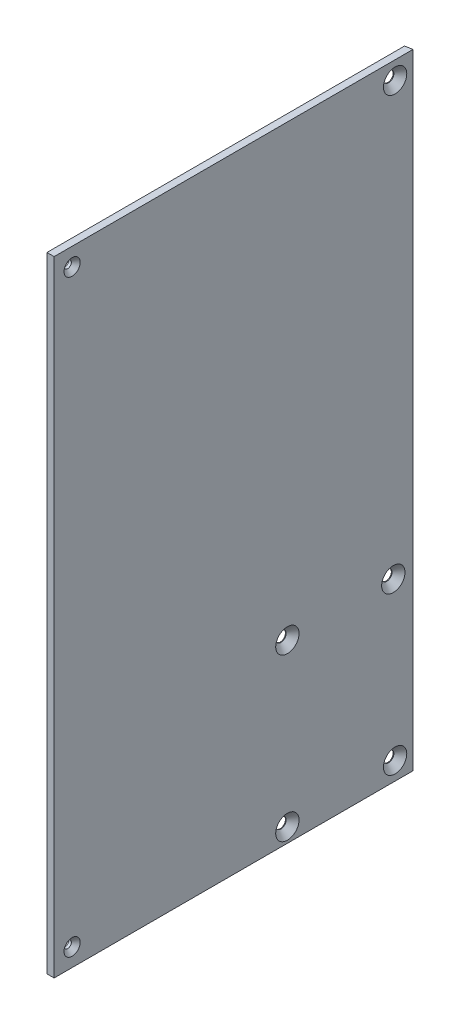
ISO-10303-21;
HEADER;
FILE_DESCRIPTION(('STEP AP214'),'2;1');
FILE_NAME('part.step','',(''),(''),'','','');
FILE_SCHEMA(('AUTOMOTIVE_DESIGN { 1 0 10303 214 1 1 1 1 }'));
ENDSEC;
DATA;
#1=APPLICATION_CONTEXT('core data for automotive mechanical design processes');
#2=APPLICATION_PROTOCOL_DEFINITION('international standard','automotive_design',2000,#1);
#3=PRODUCT_CONTEXT('',#1,'mechanical');
#4=PRODUCT('Part','Part','',(#3));
#5=PRODUCT_RELATED_PRODUCT_CATEGORY('part','',(#4));
#6=PRODUCT_DEFINITION_FORMATION('','',#4);
#7=PRODUCT_DEFINITION_CONTEXT('part definition',#1,'design');
#8=PRODUCT_DEFINITION('design','',#6,#7);
#9=PRODUCT_DEFINITION_SHAPE('','',#8);
#10=(LENGTH_UNIT() NAMED_UNIT(*) SI_UNIT(.MILLI.,.METRE.));
#11=(NAMED_UNIT(*) PLANE_ANGLE_UNIT() SI_UNIT($,.RADIAN.));
#12=(NAMED_UNIT(*) SI_UNIT($,.STERADIAN.) SOLID_ANGLE_UNIT());
#13=UNCERTAINTY_MEASURE_WITH_UNIT(LENGTH_MEASURE(1.E-05),#10,'distance_accuracy_value','');
#14=(GEOMETRIC_REPRESENTATION_CONTEXT(3) GLOBAL_UNCERTAINTY_ASSIGNED_CONTEXT((#13)) GLOBAL_UNIT_ASSIGNED_CONTEXT((#10,
#11,#12)) REPRESENTATION_CONTEXT('',''));
#15=CARTESIAN_POINT('',(0.,0.,0.));
#16=DIRECTION('',(0.,0.,1.));
#17=DIRECTION('',(1.,0.,0.));
#18=AXIS2_PLACEMENT_3D('',#15,#16,#17);
#19=CARTESIAN_POINT('',(80.9035305009001,3.,39.4332950003212));
#20=DIRECTION('',(0.,-1.,0.));
#21=DIRECTION('',(0.,0.,-1.));
#22=AXIS2_PLACEMENT_3D('',#19,#20,#21);
#23=PLANE('',#22);
#24=DIRECTION('',(-0.983268675216208,0.,0.18216122622162));
#25=VECTOR('',#24,1.);
#26=CARTESIAN_POINT('',(80.9035305009001,3.,39.8038167728806));
#27=LINE('',#26,#25);
#28=CARTESIAN_POINT('',(82.9035305009001,3.,39.4332950003212));
#29=VERTEX_POINT('',#28);
#30=CARTESIAN_POINT('',(80.9035305009001,3.,39.8038167728806));
#31=VERTEX_POINT('',#30);
#32=EDGE_CURVE('E99',#29,#31,#27,.T.);
#33=ORIENTED_EDGE('',*,*,#32,.F.);
#34=DIRECTION('',(0.,0.,-1.));
#35=VECTOR('',#34,1.);
#36=CARTESIAN_POINT('',(82.9035305009001,3.,39.4332950003212));
#37=LINE('',#36,#35);
#38=CARTESIAN_POINT('',(82.9035305009001,3.,139.399262949457));
#39=VERTEX_POINT('',#38);
#40=EDGE_CURVE('E94',#39,#29,#37,.T.);
#41=ORIENTED_EDGE('',*,*,#40,.F.);
#42=DIRECTION('',(1.,0.,0.));
#43=VECTOR('',#42,1.);
#44=CARTESIAN_POINT('',(80.9035305009001,3.,139.399262949457));
#45=LINE('',#44,#43);
#46=CARTESIAN_POINT('',(80.9035305009001,3.,139.399262949457));
#47=VERTEX_POINT('',#46);
#48=EDGE_CURVE('E11',#47,#39,#45,.T.);
#49=ORIENTED_EDGE('',*,*,#48,.F.);
#50=DIRECTION('',(0.,0.,-1.));
#51=VECTOR('',#50,1.);
#52=CARTESIAN_POINT('',(80.9035305009001,3.,39.4332950003212));
#53=LINE('',#52,#51);
#54=EDGE_CURVE('E106',#47,#31,#53,.T.);
#55=ORIENTED_EDGE('',*,*,#54,.T.);
#56=EDGE_LOOP('',(#33,#41,#49,#55));
#57=FACE_BOUND('',#56,.T.);
#58=ADVANCED_FACE('F49',(#57),#23,.T.);
#59=CARTESIAN_POINT('',(80.9035305009001,177.,139.399262949457));
#60=DIRECTION('',(0.,0.,1.));
#61=DIRECTION('',(1.,0.,0.));
#62=AXIS2_PLACEMENT_3D('',#59,#60,#61);
#63=PLANE('',#62);
#64=DIRECTION('',(0.,-1.,0.));
#65=VECTOR('',#64,1.);
#66=CARTESIAN_POINT('',(82.9035305009001,177.,139.399262949457));
#67=LINE('',#66,#65);
#68=CARTESIAN_POINT('',(82.9035305009001,177.,139.399262949457));
#69=VERTEX_POINT('',#68);
#70=EDGE_CURVE('E84',#69,#39,#67,.T.);
#71=ORIENTED_EDGE('',*,*,#70,.F.);
#72=DIRECTION('',(1.,0.,0.));
#73=VECTOR('',#72,1.);
#74=CARTESIAN_POINT('',(80.9035305009001,177.,139.399262949457));
#75=LINE('',#74,#73);
#76=CARTESIAN_POINT('',(80.9035305009001,177.,139.399262949457));
#77=VERTEX_POINT('',#76);
#78=EDGE_CURVE('E59',#77,#69,#75,.T.);
#79=ORIENTED_EDGE('',*,*,#78,.F.);
#80=DIRECTION('',(0.,-1.,0.));
#81=VECTOR('',#80,1.);
#82=CARTESIAN_POINT('',(80.9035305009001,177.,139.399262949457));
#83=LINE('',#82,#81);
#84=EDGE_CURVE('E87',#77,#47,#83,.T.);
#85=ORIENTED_EDGE('',*,*,#84,.T.);
#86=ORIENTED_EDGE('',*,*,#48,.T.);
#87=EDGE_LOOP('',(#71,#79,#85,#86));
#88=FACE_BOUND('',#87,.T.);
#89=ADVANCED_FACE('F83',(#88),#63,.T.);
#90=CARTESIAN_POINT('',(80.9035305009001,177.,39.4332950003212));
#91=DIRECTION('',(0.,1.,0.));
#92=DIRECTION('',(0.,0.,1.));
#93=AXIS2_PLACEMENT_3D('',#90,#91,#92);
#94=PLANE('',#93);
#95=DIRECTION('',(-0.983268675216208,0.,0.18216122622162));
#96=VECTOR('',#95,1.);
#97=CARTESIAN_POINT('',(80.9035305009001,177.,39.8038167728806));
#98=LINE('',#97,#96);
#99=CARTESIAN_POINT('',(82.9035305009001,177.,39.4332950003212));
#100=VERTEX_POINT('',#99);
#101=CARTESIAN_POINT('',(80.9035305009001,177.,39.8038167728806));
#102=VERTEX_POINT('',#101);
#103=EDGE_CURVE('E166',#100,#102,#98,.T.);
#104=ORIENTED_EDGE('',*,*,#103,.T.);
#105=DIRECTION('',(0.,0.,1.));
#106=VECTOR('',#105,1.);
#107=CARTESIAN_POINT('',(80.9035305009001,177.,39.4332950003212));
#108=LINE('',#107,#106);
#109=EDGE_CURVE('E100',#102,#77,#108,.T.);
#110=ORIENTED_EDGE('',*,*,#109,.T.);
#111=ORIENTED_EDGE('',*,*,#78,.T.);
#112=DIRECTION('',(0.,0.,1.));
#113=VECTOR('',#112,1.);
#114=CARTESIAN_POINT('',(82.9035305009001,177.,39.4332950003212));
#115=LINE('',#114,#113);
#116=EDGE_CURVE('E95',#100,#69,#115,.T.);
#117=ORIENTED_EDGE('',*,*,#116,.F.);
#118=EDGE_LOOP('',(#104,#110,#111,#117));
#119=FACE_BOUND('',#118,.T.);
#120=ADVANCED_FACE('F51',(#119),#94,.T.);
#121=CARTESIAN_POINT('',(80.9035305009001,0.,0.));
#122=DIRECTION('',(-1.,0.,0.));
#123=DIRECTION('',(0.,0.,1.));
#124=AXIS2_PLACEMENT_3D('',#121,#122,#123);
#125=PLANE('',#124);
#126=CARTESIAN_POINT('',(80.9035305009001,52.,74.4332950003211));
#127=DIRECTION('',(-1.,0.,0.));
#128=DIRECTION('',(0.,0.,1.));
#129=AXIS2_PLACEMENT_3D('',#126,#127,#128);
#130=CIRCLE('',#129,1.45);
#131=CARTESIAN_POINT('',(80.9035305009001,52.,75.8832950003211));
#132=VERTEX_POINT('',#131);
#133=EDGE_CURVE('E53',#132,#132,#130,.T.);
#134=ORIENTED_EDGE('',*,*,#133,.F.);
#135=EDGE_LOOP('',(#134));
#136=FACE_BOUND('',#135,.T.);
#137=CARTESIAN_POINT('',(80.9035305009001,52.,44.9332950003212));
#138=DIRECTION('',(-1.,0.,0.));
#139=DIRECTION('',(0.,0.,1.));
#140=AXIS2_PLACEMENT_3D('',#137,#138,#139);
#141=CIRCLE('',#140,1.45);
#142=CARTESIAN_POINT('',(80.9035305009001,52.,46.3832950003211));
#143=VERTEX_POINT('',#142);
#144=EDGE_CURVE('E130',#143,#143,#141,.T.);
#145=ORIENTED_EDGE('',*,*,#144,.F.);
#146=EDGE_LOOP('',(#145));
#147=FACE_BOUND('',#146,.T.);
#148=CARTESIAN_POINT('',(80.9035305009001,7.,74.4332950003211));
#149=DIRECTION('',(-1.,0.,0.));
#150=DIRECTION('',(0.,0.,1.));
#151=AXIS2_PLACEMENT_3D('',#148,#149,#150);
#152=CIRCLE('',#151,1.45);
#153=CARTESIAN_POINT('',(80.9035305009001,7.,75.8832950003211));
#154=VERTEX_POINT('',#153);
#155=EDGE_CURVE('E126',#154,#154,#152,.T.);
#156=ORIENTED_EDGE('',*,*,#155,.F.);
#157=EDGE_LOOP('',(#156));
#158=FACE_BOUND('',#157,.T.);
#159=CARTESIAN_POINT('',(80.9035305009001,172.,44.4332950003212));
#160=DIRECTION('',(-1.,0.,0.));
#161=DIRECTION('',(0.,0.,1.));
#162=AXIS2_PLACEMENT_3D('',#159,#160,#161);
#163=CIRCLE('',#162,1.45000000000001);
#164=CARTESIAN_POINT('',(80.9035305009001,172.,45.8832950003212));
#165=VERTEX_POINT('',#164);
#166=EDGE_CURVE('E121',#165,#165,#163,.T.);
#167=ORIENTED_EDGE('',*,*,#166,.F.);
#168=EDGE_LOOP('',(#167));
#169=FACE_BOUND('',#168,.T.);
#170=CARTESIAN_POINT('',(80.9035305009001,8.,44.4332950003212));
#171=DIRECTION('',(-1.,0.,0.));
#172=DIRECTION('',(0.,0.,1.));
#173=AXIS2_PLACEMENT_3D('',#170,#171,#172);
#174=CIRCLE('',#173,1.45);
#175=CARTESIAN_POINT('',(80.9035305009001,8.,45.8832950003211));
#176=VERTEX_POINT('',#175);
#177=EDGE_CURVE('E116',#176,#176,#174,.T.);
#178=ORIENTED_EDGE('',*,*,#177,.F.);
#179=EDGE_LOOP('',(#178));
#180=FACE_BOUND('',#179,.T.);
#181=CARTESIAN_POINT('',(80.9035305009001,172.,134.399262949457));
#182=DIRECTION('',(-1.,0.,0.));
#183=DIRECTION('',(0.,0.,1.));
#184=AXIS2_PLACEMENT_3D('',#181,#182,#183);
#185=CIRCLE('',#184,1.025);
#186=CARTESIAN_POINT('',(80.9035305009001,172.,135.424262949457));
#187=VERTEX_POINT('',#186);
#188=EDGE_CURVE('E111',#187,#187,#185,.T.);
#189=ORIENTED_EDGE('',*,*,#188,.F.);
#190=EDGE_LOOP('',(#189));
#191=FACE_BOUND('',#190,.T.);
#192=CARTESIAN_POINT('',(80.9035305009001,8.,134.399262949457));
#193=DIRECTION('',(-1.,0.,0.));
#194=DIRECTION('',(0.,0.,1.));
#195=AXIS2_PLACEMENT_3D('',#192,#193,#194);
#196=CIRCLE('',#195,1.025);
#197=CARTESIAN_POINT('',(80.9035305009001,8.,135.424262949457));
#198=VERTEX_POINT('',#197);
#199=EDGE_CURVE('E107',#198,#198,#196,.T.);
#200=ORIENTED_EDGE('',*,*,#199,.F.);
#201=EDGE_LOOP('',(#200));
#202=FACE_BOUND('',#201,.T.);
#203=DIRECTION('',(0.,-1.,0.));
#204=VECTOR('',#203,1.);
#205=CARTESIAN_POINT('',(80.9035305009001,179.034032050864,39.8038167728806));
#206=LINE('',#205,#204);
#207=EDGE_CURVE('E169',#102,#31,#206,.T.);
#208=ORIENTED_EDGE('',*,*,#207,.T.);
#209=ORIENTED_EDGE('',*,*,#54,.F.);
#210=ORIENTED_EDGE('',*,*,#84,.F.);
#211=ORIENTED_EDGE('',*,*,#109,.F.);
#212=EDGE_LOOP('',(#208,#209,#210,#211));
#213=FACE_BOUND('',#212,.T.);
#214=ADVANCED_FACE('F184',(#136,#147,#158,#169,#180,#191,#202,#213),#125,.T.);
#215=CARTESIAN_POINT('',(82.9035305009001,0.,0.));
#216=DIRECTION('',(-1.,0.,0.));
#217=DIRECTION('',(0.,0.,1.));
#218=AXIS2_PLACEMENT_3D('',#215,#216,#217);
#219=PLANE('',#218);
#220=CARTESIAN_POINT('',(82.9035305009001,52.,74.4332950003211));
#221=DIRECTION('',(1.,0.,0.));
#222=DIRECTION('',(0.,0.,-1.));
#223=AXIS2_PLACEMENT_3D('',#220,#221,#222);
#224=CIRCLE('',#223,3.25);
#225=CARTESIAN_POINT('',(82.9035305009001,52.,71.1832950003211));
#226=VERTEX_POINT('',#225);
#227=EDGE_CURVE('E393',#226,#226,#224,.T.);
#228=ORIENTED_EDGE('',*,*,#227,.F.);
#229=EDGE_LOOP('',(#228));
#230=FACE_BOUND('',#229,.T.);
#231=CARTESIAN_POINT('',(82.9035305009001,52.,44.9332950003212));
#232=DIRECTION('',(1.,0.,0.));
#233=DIRECTION('',(0.,0.,-1.));
#234=AXIS2_PLACEMENT_3D('',#231,#232,#233);
#235=CIRCLE('',#234,3.25);
#236=CARTESIAN_POINT('',(82.9035305009001,52.,41.6832950003212));
#237=VERTEX_POINT('',#236);
#238=EDGE_CURVE('E139',#237,#237,#235,.T.);
#239=ORIENTED_EDGE('',*,*,#238,.F.);
#240=EDGE_LOOP('',(#239));
#241=FACE_BOUND('',#240,.T.);
#242=CARTESIAN_POINT('',(82.9035305009001,7.,74.4332950003211));
#243=DIRECTION('',(1.,0.,0.));
#244=DIRECTION('',(0.,0.,-1.));
#245=AXIS2_PLACEMENT_3D('',#242,#243,#244);
#246=CIRCLE('',#245,3.25);
#247=CARTESIAN_POINT('',(82.9035305009001,7.,71.1832950003211));
#248=VERTEX_POINT('',#247);
#249=EDGE_CURVE('E132',#248,#248,#246,.T.);
#250=ORIENTED_EDGE('',*,*,#249,.F.);
#251=EDGE_LOOP('',(#250));
#252=FACE_BOUND('',#251,.T.);
#253=CARTESIAN_POINT('',(82.9035305009001,172.,44.4332950003212));
#254=DIRECTION('',(1.,0.,0.));
#255=DIRECTION('',(0.,0.,-1.));
#256=AXIS2_PLACEMENT_3D('',#253,#254,#255);
#257=CIRCLE('',#256,3.25);
#258=CARTESIAN_POINT('',(82.9035305009001,172.,41.1832950003211));
#259=VERTEX_POINT('',#258);
#260=EDGE_CURVE('E128',#259,#259,#257,.T.);
#261=ORIENTED_EDGE('',*,*,#260,.F.);
#262=EDGE_LOOP('',(#261));
#263=FACE_BOUND('',#262,.T.);
#264=CARTESIAN_POINT('',(82.9035305009001,8.,44.4332950003212));
#265=DIRECTION('',(1.,0.,0.));
#266=DIRECTION('',(0.,0.,-1.));
#267=AXIS2_PLACEMENT_3D('',#264,#265,#266);
#268=CIRCLE('',#267,3.25);
#269=CARTESIAN_POINT('',(82.9035305009001,8.,41.1832950003212));
#270=VERTEX_POINT('',#269);
#271=EDGE_CURVE('E124',#270,#270,#268,.T.);
#272=ORIENTED_EDGE('',*,*,#271,.F.);
#273=EDGE_LOOP('',(#272));
#274=FACE_BOUND('',#273,.T.);
#275=CARTESIAN_POINT('',(82.9035305009001,172.,134.399262949457));
#276=DIRECTION('',(1.,0.,0.));
#277=DIRECTION('',(0.,0.,-1.));
#278=AXIS2_PLACEMENT_3D('',#275,#276,#277);
#279=CIRCLE('',#278,2.25);
#280=CARTESIAN_POINT('',(82.9035305009001,172.,132.149262949457));
#281=VERTEX_POINT('',#280);
#282=EDGE_CURVE('E119',#281,#281,#279,.T.);
#283=ORIENTED_EDGE('',*,*,#282,.F.);
#284=EDGE_LOOP('',(#283));
#285=FACE_BOUND('',#284,.T.);
#286=CARTESIAN_POINT('',(82.9035305009001,8.,134.399262949457));
#287=DIRECTION('',(1.,0.,0.));
#288=DIRECTION('',(0.,0.,-1.));
#289=AXIS2_PLACEMENT_3D('',#286,#287,#288);
#290=CIRCLE('',#289,2.25);
#291=CARTESIAN_POINT('',(82.9035305009001,8.,132.149262949457));
#292=VERTEX_POINT('',#291);
#293=EDGE_CURVE('E114',#292,#292,#290,.T.);
#294=ORIENTED_EDGE('',*,*,#293,.F.);
#295=EDGE_LOOP('',(#294));
#296=FACE_BOUND('',#295,.T.);
#297=DIRECTION('',(0.,1.,0.));
#298=VECTOR('',#297,1.);
#299=CARTESIAN_POINT('',(82.9035305009001,177.,39.4332950003212));
#300=LINE('',#299,#298);
#301=EDGE_CURVE('E171',#29,#100,#300,.T.);
#302=ORIENTED_EDGE('',*,*,#301,.T.);
#303=ORIENTED_EDGE('',*,*,#116,.T.);
#304=ORIENTED_EDGE('',*,*,#70,.T.);
#305=ORIENTED_EDGE('',*,*,#40,.T.);
#306=EDGE_LOOP('',(#302,#303,#304,#305));
#307=FACE_BOUND('',#306,.T.);
#308=ADVANCED_FACE('F92',(#230,#241,#252,#263,#274,#285,#296,#307),#219,.F.);
#309=CARTESIAN_POINT('',(80.9035305009001,179.034032050864,39.8038167728806));
#310=DIRECTION('',(0.182161226221619,0.,0.983268675216208));
#311=DIRECTION('',(0.983268675216208,0.,-0.18216122622162));
#312=AXIS2_PLACEMENT_3D('',#309,#310,#311);
#313=PLANE('',#312);
#314=ORIENTED_EDGE('',*,*,#301,.F.);
#315=ORIENTED_EDGE('',*,*,#32,.T.);
#316=ORIENTED_EDGE('',*,*,#207,.F.);
#317=ORIENTED_EDGE('',*,*,#103,.F.);
#318=EDGE_LOOP('',(#314,#315,#316,#317));
#319=FACE_BOUND('',#318,.T.);
#320=ADVANCED_FACE('F177',(#319),#313,.F.);
#321=CARTESIAN_POINT('',(82.9035305009001,8.,134.399262949457));
#322=DIRECTION('',(1.,0.,0.));
#323=DIRECTION('',(0.,0.,-1.));
#324=AXIS2_PLACEMENT_3D('',#321,#322,#323);
#325=CYLINDRICAL_SURFACE('',#324,1.025);
#326=ORIENTED_EDGE('',*,*,#199,.T.);
#327=EDGE_LOOP('',(#326));
#328=FACE_BOUND('',#327,.T.);
#329=CARTESIAN_POINT('',(81.6785305009001,8.,134.399262949457));
#330=DIRECTION('',(1.,0.,0.));
#331=DIRECTION('',(0.,0.,-1.));
#332=AXIS2_PLACEMENT_3D('',#329,#330,#331);
#333=CIRCLE('',#332,1.025);
#334=CARTESIAN_POINT('',(81.6785305009001,8.,133.374262949457));
#335=VERTEX_POINT('',#334);
#336=EDGE_CURVE('E110',#335,#335,#333,.T.);
#337=ORIENTED_EDGE('',*,*,#336,.T.);
#338=EDGE_LOOP('',(#337));
#339=FACE_BOUND('',#338,.T.);
#340=ADVANCED_FACE('F235',(#328,#339),#325,.F.);
#341=CARTESIAN_POINT('',(82.9035305009001,8.,134.399262949457));
#342=DIRECTION('',(1.,0.,0.));
#343=DIRECTION('',(0.,0.,-1.));
#344=AXIS2_PLACEMENT_3D('',#341,#342,#343);
#345=CONICAL_SURFACE('',#344,2.25,0.785398163397448);
#346=ORIENTED_EDGE('',*,*,#336,.F.);
#347=EDGE_LOOP('',(#346));
#348=FACE_BOUND('',#347,.T.);
#349=ORIENTED_EDGE('',*,*,#293,.T.);
#350=EDGE_LOOP('',(#349));
#351=FACE_BOUND('',#350,.T.);
#352=ADVANCED_FACE('F244',(#348,#351),#345,.F.);
#353=CARTESIAN_POINT('',(82.9035305009001,172.,134.399262949457));
#354=DIRECTION('',(1.,0.,0.));
#355=DIRECTION('',(0.,0.,-1.));
#356=AXIS2_PLACEMENT_3D('',#353,#354,#355);
#357=CYLINDRICAL_SURFACE('',#356,1.025);
#358=ORIENTED_EDGE('',*,*,#188,.T.);
#359=EDGE_LOOP('',(#358));
#360=FACE_BOUND('',#359,.T.);
#361=CARTESIAN_POINT('',(81.6785305009001,172.,134.399262949457));
#362=DIRECTION('',(1.,0.,0.));
#363=DIRECTION('',(0.,0.,-1.));
#364=AXIS2_PLACEMENT_3D('',#361,#362,#363);
#365=CIRCLE('',#364,1.025);
#366=CARTESIAN_POINT('',(81.6785305009001,172.,133.374262949457));
#367=VERTEX_POINT('',#366);
#368=EDGE_CURVE('E115',#367,#367,#365,.T.);
#369=ORIENTED_EDGE('',*,*,#368,.T.);
#370=EDGE_LOOP('',(#369));
#371=FACE_BOUND('',#370,.T.);
#372=ADVANCED_FACE('F255',(#360,#371),#357,.F.);
#373=CARTESIAN_POINT('',(82.9035305009001,172.,134.399262949457));
#374=DIRECTION('',(1.,0.,0.));
#375=DIRECTION('',(0.,0.,-1.));
#376=AXIS2_PLACEMENT_3D('',#373,#374,#375);
#377=CONICAL_SURFACE('',#376,2.25,0.785398163397448);
#378=ORIENTED_EDGE('',*,*,#368,.F.);
#379=EDGE_LOOP('',(#378));
#380=FACE_BOUND('',#379,.T.);
#381=ORIENTED_EDGE('',*,*,#282,.T.);
#382=EDGE_LOOP('',(#381));
#383=FACE_BOUND('',#382,.T.);
#384=ADVANCED_FACE('F266',(#380,#383),#377,.F.);
#385=CARTESIAN_POINT('',(82.9035305009001,8.,44.4332950003212));
#386=DIRECTION('',(1.,0.,0.));
#387=DIRECTION('',(0.,0.,-1.));
#388=AXIS2_PLACEMENT_3D('',#385,#386,#387);
#389=CYLINDRICAL_SURFACE('',#388,1.45);
#390=ORIENTED_EDGE('',*,*,#177,.T.);
#391=EDGE_LOOP('',(#390));
#392=FACE_BOUND('',#391,.T.);
#393=CARTESIAN_POINT('',(81.1035305009001,8.,44.4332950003212));
#394=DIRECTION('',(1.,0.,0.));
#395=DIRECTION('',(0.,0.,-1.));
#396=AXIS2_PLACEMENT_3D('',#393,#394,#395);
#397=CIRCLE('',#396,1.45);
#398=CARTESIAN_POINT('',(81.1035305009001,8.,42.9832950003211));
#399=VERTEX_POINT('',#398);
#400=EDGE_CURVE('E120',#399,#399,#397,.T.);
#401=ORIENTED_EDGE('',*,*,#400,.T.);
#402=EDGE_LOOP('',(#401));
#403=FACE_BOUND('',#402,.T.);
#404=ADVANCED_FACE('F277',(#392,#403),#389,.F.);
#405=CARTESIAN_POINT('',(82.9035305009001,8.,44.4332950003212));
#406=DIRECTION('',(1.,0.,0.));
#407=DIRECTION('',(0.,0.,-1.));
#408=AXIS2_PLACEMENT_3D('',#405,#406,#407);
#409=CONICAL_SURFACE('',#408,3.25,0.78539816339745);
#410=ORIENTED_EDGE('',*,*,#400,.F.);
#411=EDGE_LOOP('',(#410));
#412=FACE_BOUND('',#411,.T.);
#413=ORIENTED_EDGE('',*,*,#271,.T.);
#414=EDGE_LOOP('',(#413));
#415=FACE_BOUND('',#414,.T.);
#416=ADVANCED_FACE('F288',(#412,#415),#409,.F.);
#417=CARTESIAN_POINT('',(82.9035305009001,172.,44.4332950003212));
#418=DIRECTION('',(1.,0.,0.));
#419=DIRECTION('',(0.,0.,-1.));
#420=AXIS2_PLACEMENT_3D('',#417,#418,#419);
#421=CYLINDRICAL_SURFACE('',#420,1.45000000000001);
#422=ORIENTED_EDGE('',*,*,#166,.T.);
#423=EDGE_LOOP('',(#422));
#424=FACE_BOUND('',#423,.T.);
#425=CARTESIAN_POINT('',(81.1035305009001,172.,44.4332950003212));
#426=DIRECTION('',(1.,0.,0.));
#427=DIRECTION('',(0.,0.,-1.));
#428=AXIS2_PLACEMENT_3D('',#425,#426,#427);
#429=CIRCLE('',#428,1.45000000000001);
#430=CARTESIAN_POINT('',(81.1035305009001,172.,42.9832950003211));
#431=VERTEX_POINT('',#430);
#432=EDGE_CURVE('E125',#431,#431,#429,.T.);
#433=ORIENTED_EDGE('',*,*,#432,.T.);
#434=EDGE_LOOP('',(#433));
#435=FACE_BOUND('',#434,.T.);
#436=ADVANCED_FACE('F299',(#424,#435),#421,.F.);
#437=CARTESIAN_POINT('',(82.9035305009001,172.,44.4332950003212));
#438=DIRECTION('',(1.,0.,0.));
#439=DIRECTION('',(0.,0.,-1.));
#440=AXIS2_PLACEMENT_3D('',#437,#438,#439);
#441=CONICAL_SURFACE('',#440,3.25,0.785398163397448);
#442=ORIENTED_EDGE('',*,*,#432,.F.);
#443=EDGE_LOOP('',(#442));
#444=FACE_BOUND('',#443,.T.);
#445=ORIENTED_EDGE('',*,*,#260,.T.);
#446=EDGE_LOOP('',(#445));
#447=FACE_BOUND('',#446,.T.);
#448=ADVANCED_FACE('F310',(#444,#447),#441,.F.);
#449=CARTESIAN_POINT('',(82.9035305009001,7.,74.4332950003211));
#450=DIRECTION('',(1.,0.,0.));
#451=DIRECTION('',(0.,0.,-1.));
#452=AXIS2_PLACEMENT_3D('',#449,#450,#451);
#453=CYLINDRICAL_SURFACE('',#452,1.45);
#454=ORIENTED_EDGE('',*,*,#155,.T.);
#455=EDGE_LOOP('',(#454));
#456=FACE_BOUND('',#455,.T.);
#457=CARTESIAN_POINT('',(81.1035305009001,7.,74.4332950003211));
#458=DIRECTION('',(1.,0.,0.));
#459=DIRECTION('',(0.,0.,-1.));
#460=AXIS2_PLACEMENT_3D('',#457,#458,#459);
#461=CIRCLE('',#460,1.45);
#462=CARTESIAN_POINT('',(81.1035305009001,7.,72.9832950003211));
#463=VERTEX_POINT('',#462);
#464=EDGE_CURVE('E129',#463,#463,#461,.T.);
#465=ORIENTED_EDGE('',*,*,#464,.T.);
#466=EDGE_LOOP('',(#465));
#467=FACE_BOUND('',#466,.T.);
#468=ADVANCED_FACE('F320',(#456,#467),#453,.F.);
#469=CARTESIAN_POINT('',(82.9035305009001,7.,74.4332950003211));
#470=DIRECTION('',(1.,0.,0.));
#471=DIRECTION('',(0.,0.,-1.));
#472=AXIS2_PLACEMENT_3D('',#469,#470,#471);
#473=CONICAL_SURFACE('',#472,3.25,0.78539816339745);
#474=ORIENTED_EDGE('',*,*,#464,.F.);
#475=EDGE_LOOP('',(#474));
#476=FACE_BOUND('',#475,.T.);
#477=ORIENTED_EDGE('',*,*,#249,.T.);
#478=EDGE_LOOP('',(#477));
#479=FACE_BOUND('',#478,.T.);
#480=ADVANCED_FACE('F330',(#476,#479),#473,.F.);
#481=CARTESIAN_POINT('',(82.9035305009001,52.,44.9332950003212));
#482=DIRECTION('',(1.,0.,0.));
#483=DIRECTION('',(0.,0.,-1.));
#484=AXIS2_PLACEMENT_3D('',#481,#482,#483);
#485=CYLINDRICAL_SURFACE('',#484,1.45);
#486=ORIENTED_EDGE('',*,*,#144,.T.);
#487=EDGE_LOOP('',(#486));
#488=FACE_BOUND('',#487,.T.);
#489=CARTESIAN_POINT('',(81.1035305009001,52.,44.9332950003212));
#490=DIRECTION('',(1.,0.,0.));
#491=DIRECTION('',(0.,0.,-1.));
#492=AXIS2_PLACEMENT_3D('',#489,#490,#491);
#493=CIRCLE('',#492,1.45);
#494=CARTESIAN_POINT('',(81.1035305009001,52.,43.4832950003212));
#495=VERTEX_POINT('',#494);
#496=EDGE_CURVE('E133',#495,#495,#493,.T.);
#497=ORIENTED_EDGE('',*,*,#496,.T.);
#498=EDGE_LOOP('',(#497));
#499=FACE_BOUND('',#498,.T.);
#500=ADVANCED_FACE('F341',(#488,#499),#485,.F.);
#501=CARTESIAN_POINT('',(82.9035305009001,52.,44.9332950003212));
#502=DIRECTION('',(1.,0.,0.));
#503=DIRECTION('',(0.,0.,-1.));
#504=AXIS2_PLACEMENT_3D('',#501,#502,#503);
#505=CONICAL_SURFACE('',#504,3.25,0.78539816339745);
#506=ORIENTED_EDGE('',*,*,#496,.F.);
#507=EDGE_LOOP('',(#506));
#508=FACE_BOUND('',#507,.T.);
#509=ORIENTED_EDGE('',*,*,#238,.T.);
#510=EDGE_LOOP('',(#509));
#511=FACE_BOUND('',#510,.T.);
#512=ADVANCED_FACE('F352',(#508,#511),#505,.F.);
#513=CARTESIAN_POINT('',(82.9035305009001,52.,74.4332950003211));
#514=DIRECTION('',(1.,0.,0.));
#515=DIRECTION('',(0.,0.,-1.));
#516=AXIS2_PLACEMENT_3D('',#513,#514,#515);
#517=CYLINDRICAL_SURFACE('',#516,1.45);
#518=ORIENTED_EDGE('',*,*,#133,.T.);
#519=EDGE_LOOP('',(#518));
#520=FACE_BOUND('',#519,.T.);
#521=CARTESIAN_POINT('',(81.1035305009001,52.,74.4332950003211));
#522=DIRECTION('',(1.,0.,0.));
#523=DIRECTION('',(0.,0.,-1.));
#524=AXIS2_PLACEMENT_3D('',#521,#522,#523);
#525=CIRCLE('',#524,1.45);
#526=CARTESIAN_POINT('',(81.1035305009001,52.,72.9832950003211));
#527=VERTEX_POINT('',#526);
#528=EDGE_CURVE('E390',#527,#527,#525,.T.);
#529=ORIENTED_EDGE('',*,*,#528,.T.);
#530=EDGE_LOOP('',(#529));
#531=FACE_BOUND('',#530,.T.);
#532=ADVANCED_FACE('F362',(#520,#531),#517,.F.);
#533=CARTESIAN_POINT('',(82.9035305009001,52.,74.4332950003211));
#534=DIRECTION('',(1.,0.,0.));
#535=DIRECTION('',(0.,0.,-1.));
#536=AXIS2_PLACEMENT_3D('',#533,#534,#535);
#537=CONICAL_SURFACE('',#536,3.25,0.78539816339745);
#538=ORIENTED_EDGE('',*,*,#528,.F.);
#539=EDGE_LOOP('',(#538));
#540=FACE_BOUND('',#539,.T.);
#541=ORIENTED_EDGE('',*,*,#227,.T.);
#542=EDGE_LOOP('',(#541));
#543=FACE_BOUND('',#542,.T.);
#544=ADVANCED_FACE('F373',(#540,#543),#537,.F.);
#545=CLOSED_SHELL('',(#58,#89,#120,#214,#308,#320,#340,#352,#372,#384,#404,#416,#436,#448,#468,
#480,#500,#512,#532,#544));
#546=MANIFOLD_SOLID_BREP('B2',#545);
#547=ADVANCED_BREP_SHAPE_REPRESENTATION('',(#18,#546),#14);
#548=SHAPE_DEFINITION_REPRESENTATION(#9,#547);
ENDSEC;
END-ISO-10303-21;
